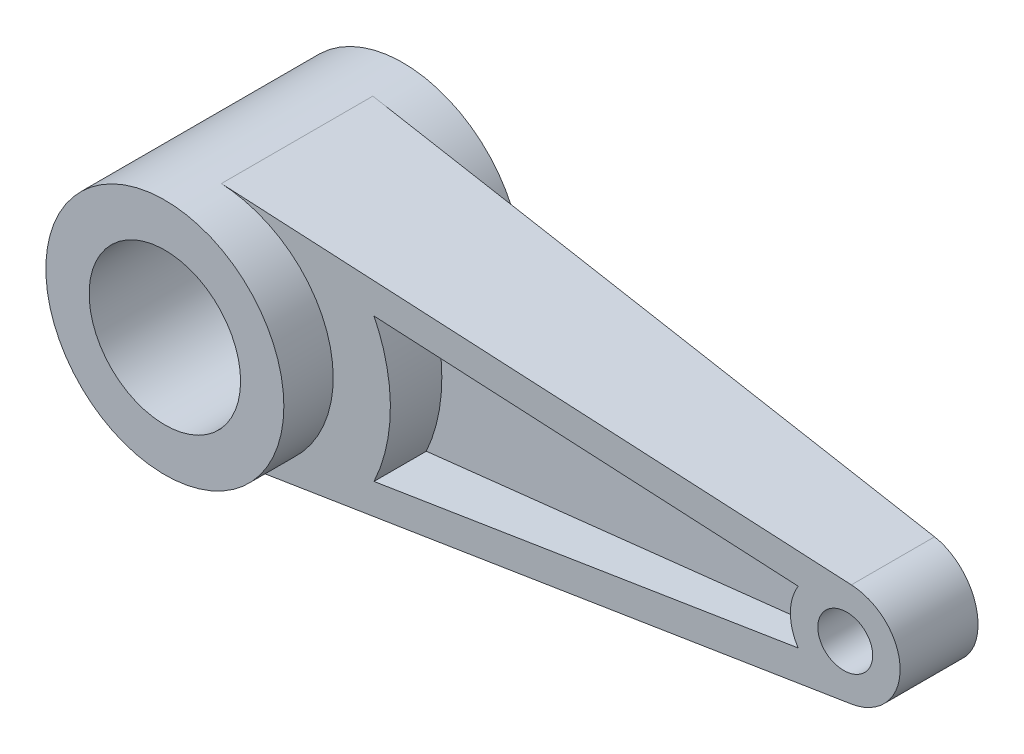
ISO-10303-21;
HEADER;
FILE_DESCRIPTION(('STEP AP214'),'2;1');
FILE_NAME('part.step','',(''),(''),'','','');
FILE_SCHEMA(('AUTOMOTIVE_DESIGN { 1 0 10303 214 1 1 1 1 }'));
ENDSEC;
DATA;
#1=APPLICATION_CONTEXT('core data for automotive mechanical design processes');
#2=APPLICATION_PROTOCOL_DEFINITION('international standard','automotive_design',2000,#1);
#3=PRODUCT_CONTEXT('',#1,'mechanical');
#4=PRODUCT('Part','Part','',(#3));
#5=PRODUCT_RELATED_PRODUCT_CATEGORY('part','',(#4));
#6=PRODUCT_DEFINITION_FORMATION('','',#4);
#7=PRODUCT_DEFINITION_CONTEXT('part definition',#1,'design');
#8=PRODUCT_DEFINITION('design','',#6,#7);
#9=PRODUCT_DEFINITION_SHAPE('','',#8);
#10=(LENGTH_UNIT() NAMED_UNIT(*) SI_UNIT(.MILLI.,.METRE.));
#11=(NAMED_UNIT(*) PLANE_ANGLE_UNIT() SI_UNIT($,.RADIAN.));
#12=(NAMED_UNIT(*) SI_UNIT($,.STERADIAN.) SOLID_ANGLE_UNIT());
#13=UNCERTAINTY_MEASURE_WITH_UNIT(LENGTH_MEASURE(1.E-05),#10,'distance_accuracy_value','');
#14=(GEOMETRIC_REPRESENTATION_CONTEXT(3) GLOBAL_UNCERTAINTY_ASSIGNED_CONTEXT((#13)) GLOBAL_UNIT_ASSIGNED_CONTEXT((#10,
#11,#12)) REPRESENTATION_CONTEXT('',''));
#15=CARTESIAN_POINT('',(0.,0.,0.));
#16=DIRECTION('',(0.,0.,1.));
#17=DIRECTION('',(1.,0.,0.));
#18=AXIS2_PLACEMENT_3D('',#15,#16,#17);
#19=CARTESIAN_POINT('',(1.00946889483169,-34.,17.6173647871382));
#20=DIRECTION('',(0.0572058197716256,0.,0.998362406235459));
#21=DIRECTION('',(0.998362406235459,0.,-0.0572058197716256));
#22=AXIS2_PLACEMENT_3D('',#19,#20,#21);
#23=PLANE('',#22);
#24=CARTESIAN_POINT('',(0.,0.,17.6752070048561));
#25=DIRECTION('',(0.0572058197716256,0.,0.998362406235459));
#26=DIRECTION('',(-0.998362406235459,0.,0.0572058197716256));
#27=AXIS2_PLACEMENT_3D('',#24,#25,#26);
#28=ELLIPSE('',#27,27.5451076966076,27.5);
#29=CARTESIAN_POINT('',(3.05773237156157,-27.3294762617929,17.5));
#30=VERTEX_POINT('',#29);
#31=CARTESIAN_POINT('',(3.05773237156158,27.3294762617929,17.5));
#32=VERTEX_POINT('',#31);
#33=EDGE_CURVE('E360',#30,#32,#28,.T.);
#34=ORIENTED_EDGE('',*,*,#33,.F.);
#35=DIRECTION('',(0.992191769215526,0.111010429269318,-0.056852244409579));
#36=VECTOR('',#35,1.);
#37=CARTESIAN_POINT('',(3.05773237156157,-27.3294762617929,17.5));
#38=LINE('',#37,#36);
#39=CARTESIAN_POINT('',(140.734972421641,-11.9255896415097,9.61114187416411));
#40=VERTEX_POINT('',#39);
#41=EDGE_CURVE('E155',#30,#40,#38,.T.);
#42=ORIENTED_EDGE('',*,*,#41,.T.);
#43=CARTESIAN_POINT('',(139.40068920496,0.,9.68759583991949));
#44=DIRECTION('',(0.0572058197716256,0.,0.998362406235459));
#45=DIRECTION('',(0.998362406235459,0.,-0.0572058197716256));
#46=AXIS2_PLACEMENT_3D('',#43,#44,#45);
#47=ELLIPSE('',#46,12.0196833585197,12.);
#48=CARTESIAN_POINT('',(140.734972421641,11.9255896415097,9.61114187416411));
#49=VERTEX_POINT('',#48);
#50=EDGE_CURVE('E162',#40,#49,#47,.T.);
#51=ORIENTED_EDGE('',*,*,#50,.T.);
#52=DIRECTION('',(0.992191769215526,-0.111010429269318,-0.056852244409579));
#53=VECTOR('',#52,1.);
#54=CARTESIAN_POINT('',(3.05773237156158,27.3294762617929,17.5));
#55=LINE('',#54,#53);
#56=EDGE_CURVE('E152',#32,#49,#55,.T.);
#57=ORIENTED_EDGE('',*,*,#56,.F.);
#58=EDGE_LOOP('',(#34,#42,#51,#57));
#59=FACE_BOUND('',#58,.T.);
#60=CARTESIAN_POINT('',(139.40068920496,0.,9.68759583991948));
#61=DIRECTION('',(0.0572058197716256,0.,0.998362406235459));
#62=DIRECTION('',(-0.998362406235459,0.,0.0572058197716256));
#63=AXIS2_PLACEMENT_3D('',#60,#61,#62);
#64=ELLIPSE('',#63,6.00984167925985,6.00000000000002);
#65=CARTESIAN_POINT('',(133.40068920496,0.,10.0313937598792));
#66=VERTEX_POINT('',#65);
#67=EDGE_CURVE('E177',#66,#66,#64,.T.);
#68=ORIENTED_EDGE('',*,*,#67,.F.);
#69=EDGE_LOOP('',(#68));
#70=FACE_BOUND('',#69,.T.);
#71=DIRECTION('',(0.992191769215526,-0.111010429269318,-0.056852244409579));
#72=VECTOR('',#71,1.);
#73=CARTESIAN_POINT('',(7.01394552238994,19.843162251959,17.2733103579713));
#74=LINE('',#73,#72);
#75=CARTESIAN_POINT('',(36.4139054055988,16.5537757962376,15.5887028488468));
#76=VERTEX_POINT('',#75);
#77=CARTESIAN_POINT('',(129.115571862201,6.181938308143,10.2769294980832));
#78=VERTEX_POINT('',#77);
#79=EDGE_CURVE('E186',#76,#78,#74,.T.);
#80=ORIENTED_EDGE('',*,*,#79,.T.);
#81=CARTESIAN_POINT('',(139.40068920496,0.,9.68759583991949));
#82=DIRECTION('',(0.0572058197716256,0.,0.998362406235459));
#83=DIRECTION('',(0.998362406235459,0.,-0.0572058197716256));
#84=AXIS2_PLACEMENT_3D('',#81,#82,#83);
#85=ELLIPSE('',#84,12.0196833585197,12.);
#86=CARTESIAN_POINT('',(129.115571862201,-6.181938308143,10.2769294980832));
#87=VERTEX_POINT('',#86);
#88=EDGE_CURVE('E190',#78,#87,#85,.T.);
#89=ORIENTED_EDGE('',*,*,#88,.T.);
#90=DIRECTION('',(-0.992191769215526,-0.111010429269318,0.056852244409579));
#91=VECTOR('',#90,1.);
#92=CARTESIAN_POINT('',(-0.475821604440821,-20.6811476996049,17.7024714178358));
#93=LINE('',#92,#91);
#94=CARTESIAN_POINT('',(36.4139054055988,-16.5537757962376,15.5887028488468));
#95=VERTEX_POINT('',#94);
#96=EDGE_CURVE('E172',#87,#95,#93,.T.);
#97=ORIENTED_EDGE('',*,*,#96,.T.);
#98=CARTESIAN_POINT('',(0.,0.,17.6752070048561));
#99=DIRECTION('',(0.0572058197716256,0.,0.998362406235459));
#100=DIRECTION('',(0.998362406235459,0.,-0.0572058197716256));
#101=AXIS2_PLACEMENT_3D('',#98,#99,#100);
#102=ELLIPSE('',#101,40.0656111950656,40.);
#103=EDGE_CURVE('E182',#95,#76,#102,.T.);
#104=ORIENTED_EDGE('',*,*,#103,.T.);
#105=EDGE_LOOP('',(#80,#89,#97,#104));
#106=FACE_BOUND('',#105,.T.);
#107=ADVANCED_FACE('F45',(#59,#70,#106),#23,.T.);
#108=CARTESIAN_POINT('',(3.05773237156157,-27.3294762617929,17.5));
#109=DIRECTION('',(-0.111190268056785,0.993799136792471,0.));
#110=DIRECTION('',(-0.993799136792471,-0.111190268056785,0.));
#111=AXIS2_PLACEMENT_3D('',#108,#109,#110);
#112=PLANE('',#111);
#113=DIRECTION('',(0.,0.,-1.));
#114=VECTOR('',#113,1.);
#115=CARTESIAN_POINT('',(3.05773237156158,-27.3294762617929,17.5));
#116=LINE('',#115,#114);
#117=CARTESIAN_POINT('',(3.05773237156157,-27.3294762617929,-17.5));
#118=VERTEX_POINT('',#117);
#119=EDGE_CURVE('E137',#30,#118,#116,.T.);
#120=ORIENTED_EDGE('',*,*,#119,.T.);
#121=DIRECTION('',(0.992191769215526,0.111010429269318,0.056852244409579));
#122=VECTOR('',#121,1.);
#123=CARTESIAN_POINT('',(5.03202388532305,-27.1085845398038,-17.3868737806958));
#124=LINE('',#123,#122);
#125=CARTESIAN_POINT('',(140.734972421641,-11.9255896415097,-9.61114187416411));
#126=VERTEX_POINT('',#125);
#127=EDGE_CURVE('E145',#118,#126,#124,.T.);
#128=ORIENTED_EDGE('',*,*,#127,.T.);
#129=DIRECTION('',(0.,0.,-1.));
#130=VECTOR('',#129,1.);
#131=CARTESIAN_POINT('',(140.734972421641,-11.9255896415097,17.5));
#132=LINE('',#131,#130);
#133=EDGE_CURVE('E169',#40,#126,#132,.T.);
#134=ORIENTED_EDGE('',*,*,#133,.F.);
#135=ORIENTED_EDGE('',*,*,#41,.F.);
#136=EDGE_LOOP('',(#120,#128,#134,#135));
#137=FACE_BOUND('',#136,.T.);
#138=ADVANCED_FACE('F47',(#137),#112,.F.);
#139=CARTESIAN_POINT('',(139.40068920496,0.,17.5));
#140=DIRECTION('',(0.,0.,-1.));
#141=DIRECTION('',(-1.,0.,0.));
#142=AXIS2_PLACEMENT_3D('',#139,#140,#141);
#143=CYLINDRICAL_SURFACE('',#142,12.);
#144=CARTESIAN_POINT('',(139.40068920496,0.,-9.68759583991949));
#145=DIRECTION('',(-0.0572058197716256,0.,0.998362406235459));
#146=DIRECTION('',(-0.998362406235459,0.,-0.0572058197716256));
#147=AXIS2_PLACEMENT_3D('',#144,#145,#146);
#148=ELLIPSE('',#147,12.0196833585197,12.);
#149=CARTESIAN_POINT('',(140.734972421641,11.9255896415097,-9.6111418741641));
#150=VERTEX_POINT('',#149);
#151=EDGE_CURVE('E147',#126,#150,#148,.T.);
#152=ORIENTED_EDGE('',*,*,#151,.T.);
#153=DIRECTION('',(0.,0.,-1.));
#154=VECTOR('',#153,1.);
#155=CARTESIAN_POINT('',(140.734972421641,11.9255896415097,17.5));
#156=LINE('',#155,#154);
#157=EDGE_CURVE('E160',#49,#150,#156,.T.);
#158=ORIENTED_EDGE('',*,*,#157,.F.);
#159=ORIENTED_EDGE('',*,*,#50,.F.);
#160=ORIENTED_EDGE('',*,*,#133,.T.);
#161=EDGE_LOOP('',(#152,#158,#159,#160));
#162=FACE_BOUND('',#161,.T.);
#163=ADVANCED_FACE('F275',(#162),#143,.T.);
#164=CARTESIAN_POINT('',(3.05773237156158,27.3294762617929,17.5));
#165=DIRECTION('',(0.111190268056785,0.993799136792471,0.));
#166=DIRECTION('',(-0.993799136792471,0.111190268056785,0.));
#167=AXIS2_PLACEMENT_3D('',#164,#165,#166);
#168=PLANE('',#167);
#169=DIRECTION('',(0.992191769215526,-0.111010429269318,0.056852244409579));
#170=VECTOR('',#169,1.);
#171=CARTESIAN_POINT('',(5.03202388532305,27.1085845398038,-17.3868737806958));
#172=LINE('',#171,#170);
#173=CARTESIAN_POINT('',(3.05773237156158,27.3294762617929,-17.5));
#174=VERTEX_POINT('',#173);
#175=EDGE_CURVE('E259',#174,#150,#172,.T.);
#176=ORIENTED_EDGE('',*,*,#175,.F.);
#177=DIRECTION('',(0.,0.,-1.));
#178=VECTOR('',#177,1.);
#179=CARTESIAN_POINT('',(3.05773237156158,27.3294762617929,17.5));
#180=LINE('',#179,#178);
#181=EDGE_CURVE('E140',#32,#174,#180,.T.);
#182=ORIENTED_EDGE('',*,*,#181,.F.);
#183=ORIENTED_EDGE('',*,*,#56,.T.);
#184=ORIENTED_EDGE('',*,*,#157,.T.);
#185=EDGE_LOOP('',(#176,#182,#183,#184));
#186=FACE_BOUND('',#185,.T.);
#187=ADVANCED_FACE('F274',(#186),#168,.T.);
#188=CARTESIAN_POINT('',(1.00946889483169,-34.,-17.6173647871382));
#189=DIRECTION('',(-0.0572058197716256,0.,0.998362406235459));
#190=DIRECTION('',(0.998362406235459,0.,0.0572058197716256));
#191=AXIS2_PLACEMENT_3D('',#188,#189,#190);
#192=PLANE('',#191);
#193=DIRECTION('',(0.992191769215526,0.111010429269318,0.056852244409579));
#194=VECTOR('',#193,1.);
#195=CARTESIAN_POINT('',(-0.475821604440821,-20.6811476996049,-17.7024714178358));
#196=LINE('',#195,#194);
#197=CARTESIAN_POINT('',(36.4139054055988,-16.5537757962376,-15.5887028488468));
#198=VERTEX_POINT('',#197);
#199=CARTESIAN_POINT('',(129.115571862201,-6.181938308143,-10.2769294980832));
#200=VERTEX_POINT('',#199);
#201=EDGE_CURVE('E202',#198,#200,#196,.T.);
#202=ORIENTED_EDGE('',*,*,#201,.T.);
#203=CARTESIAN_POINT('',(139.40068920496,0.,-9.68759583991949));
#204=DIRECTION('',(-0.0572058197716256,0.,0.998362406235459));
#205=DIRECTION('',(0.998362406235459,0.,0.0572058197716256));
#206=AXIS2_PLACEMENT_3D('',#203,#204,#205);
#207=ELLIPSE('',#206,12.0196833585197,12.);
#208=CARTESIAN_POINT('',(129.115571862201,6.181938308143,-10.2769294980832));
#209=VERTEX_POINT('',#208);
#210=EDGE_CURVE('E54',#200,#209,#207,.F.);
#211=ORIENTED_EDGE('',*,*,#210,.T.);
#212=DIRECTION('',(-0.992191769215526,0.111010429269318,-0.056852244409579));
#213=VECTOR('',#212,1.);
#214=CARTESIAN_POINT('',(7.01394552238994,19.843162251959,-17.2733103579713));
#215=LINE('',#214,#213);
#216=CARTESIAN_POINT('',(36.4139054055988,16.5537757962376,-15.5887028488468));
#217=VERTEX_POINT('',#216);
#218=EDGE_CURVE('E194',#209,#217,#215,.T.);
#219=ORIENTED_EDGE('',*,*,#218,.T.);
#220=CARTESIAN_POINT('',(0.,0.,-17.6752070048561));
#221=DIRECTION('',(-0.0572058197716256,0.,0.998362406235459));
#222=DIRECTION('',(0.998362406235459,0.,0.0572058197716256));
#223=AXIS2_PLACEMENT_3D('',#220,#221,#222);
#224=ELLIPSE('',#223,40.0656111950656,40.);
#225=EDGE_CURVE('E198',#217,#198,#224,.F.);
#226=ORIENTED_EDGE('',*,*,#225,.T.);
#227=EDGE_LOOP('',(#202,#211,#219,#226));
#228=FACE_BOUND('',#227,.T.);
#229=CARTESIAN_POINT('',(139.40068920496,0.,-9.68759583991949));
#230=DIRECTION('',(-0.0572058197716256,0.,0.998362406235459));
#231=DIRECTION('',(0.998362406235459,0.,0.0572058197716256));
#232=AXIS2_PLACEMENT_3D('',#229,#230,#231);
#233=ELLIPSE('',#232,6.00984167925985,6.00000000000002);
#234=CARTESIAN_POINT('',(145.40068920496,0.,-9.34379791995975));
#235=VERTEX_POINT('',#234);
#236=EDGE_CURVE('E173',#235,#235,#233,.T.);
#237=ORIENTED_EDGE('',*,*,#236,.T.);
#238=EDGE_LOOP('',(#237));
#239=FACE_BOUND('',#238,.T.);
#240=ORIENTED_EDGE('',*,*,#127,.F.);
#241=CARTESIAN_POINT('',(0.,0.,-17.6752070048561));
#242=DIRECTION('',(-0.0572058197716256,0.,0.998362406235459));
#243=DIRECTION('',(0.998362406235459,0.,0.0572058197716256));
#244=AXIS2_PLACEMENT_3D('',#241,#242,#243);
#245=ELLIPSE('',#244,27.5451076966076,27.5);
#246=EDGE_CURVE('E11',#118,#174,#245,.T.);
#247=ORIENTED_EDGE('',*,*,#246,.T.);
#248=ORIENTED_EDGE('',*,*,#175,.T.);
#249=ORIENTED_EDGE('',*,*,#151,.F.);
#250=EDGE_LOOP('',(#240,#247,#248,#249));
#251=FACE_BOUND('',#250,.T.);
#252=ADVANCED_FACE('F146',(#228,#239,#251),#192,.F.);
#253=CARTESIAN_POINT('',(139.40068920496,0.,-34.));
#254=DIRECTION('',(0.,0.,1.));
#255=DIRECTION('',(1.,0.,0.));
#256=AXIS2_PLACEMENT_3D('',#253,#254,#255);
#257=CYLINDRICAL_SURFACE('',#256,6.00000000000002);
#258=ORIENTED_EDGE('',*,*,#67,.T.);
#259=EDGE_LOOP('',(#258));
#260=FACE_BOUND('',#259,.T.);
#261=ORIENTED_EDGE('',*,*,#236,.F.);
#262=EDGE_LOOP('',(#261));
#263=FACE_BOUND('',#262,.T.);
#264=ADVANCED_FACE('F289',(#260,#263),#257,.F.);
#265=CARTESIAN_POINT('',(139.40068920496,0.,56.5));
#266=DIRECTION('',(0.,0.,-1.));
#267=DIRECTION('',(-1.,0.,0.));
#268=AXIS2_PLACEMENT_3D('',#265,#266,#267);
#269=CYLINDRICAL_SURFACE('',#268,12.);
#270=DIRECTION('',(0.,0.,-1.));
#271=VECTOR('',#270,1.);
#272=CARTESIAN_POINT('',(129.115571862201,6.181938308143,56.5));
#273=LINE('',#272,#271);
#274=CARTESIAN_POINT('',(129.115571862201,6.181938308143,3.5));
#275=VERTEX_POINT('',#274);
#276=EDGE_CURVE('E178',#78,#275,#273,.T.);
#277=ORIENTED_EDGE('',*,*,#276,.T.);
#278=CARTESIAN_POINT('',(139.40068920496,0.,3.5));
#279=DIRECTION('',(0.,0.,-1.));
#280=DIRECTION('',(1.,0.,0.));
#281=AXIS2_PLACEMENT_3D('',#278,#279,#280);
#282=CIRCLE('',#281,12.);
#283=CARTESIAN_POINT('',(129.115571862201,-6.181938308143,3.5));
#284=VERTEX_POINT('',#283);
#285=EDGE_CURVE('E224',#284,#275,#282,.T.);
#286=ORIENTED_EDGE('',*,*,#285,.F.);
#287=DIRECTION('',(0.,0.,-1.));
#288=VECTOR('',#287,1.);
#289=CARTESIAN_POINT('',(129.115571862201,-6.181938308143,56.5));
#290=LINE('',#289,#288);
#291=EDGE_CURVE('E246',#87,#284,#290,.T.);
#292=ORIENTED_EDGE('',*,*,#291,.F.);
#293=ORIENTED_EDGE('',*,*,#88,.F.);
#294=EDGE_LOOP('',(#277,#286,#292,#293));
#295=FACE_BOUND('',#294,.T.);
#296=ADVANCED_FACE('F292',(#295),#269,.T.);
#297=CARTESIAN_POINT('',(36.4139054055988,16.5537757962376,56.5));
#298=DIRECTION('',(-0.111190268056785,-0.993799136792471,0.));
#299=DIRECTION('',(0.993799136792471,-0.111190268056785,0.));
#300=AXIS2_PLACEMENT_3D('',#297,#298,#299);
#301=PLANE('',#300);
#302=DIRECTION('',(0.,0.,-1.));
#303=VECTOR('',#302,1.);
#304=CARTESIAN_POINT('',(36.4139054055988,16.5537757962376,56.5));
#305=LINE('',#304,#303);
#306=CARTESIAN_POINT('',(36.4139054055988,16.5537757962376,3.5));
#307=VERTEX_POINT('',#306);
#308=EDGE_CURVE('E251',#76,#307,#305,.T.);
#309=ORIENTED_EDGE('',*,*,#308,.T.);
#310=DIRECTION('',(-0.993799136792471,0.111190268056785,0.));
#311=VECTOR('',#310,1.);
#312=CARTESIAN_POINT('',(36.4139054055988,16.5537757962376,3.5));
#313=LINE('',#312,#311);
#314=EDGE_CURVE('E230',#275,#307,#313,.T.);
#315=ORIENTED_EDGE('',*,*,#314,.F.);
#316=ORIENTED_EDGE('',*,*,#276,.F.);
#317=ORIENTED_EDGE('',*,*,#79,.F.);
#318=EDGE_LOOP('',(#309,#315,#316,#317));
#319=FACE_BOUND('',#318,.T.);
#320=ADVANCED_FACE('F296',(#319),#301,.T.);
#321=CARTESIAN_POINT('',(0.,0.,56.5));
#322=DIRECTION('',(0.,0.,-1.));
#323=DIRECTION('',(-1.,0.,0.));
#324=AXIS2_PLACEMENT_3D('',#321,#322,#323);
#325=CYLINDRICAL_SURFACE('',#324,40.);
#326=DIRECTION('',(0.,0.,-1.));
#327=VECTOR('',#326,1.);
#328=CARTESIAN_POINT('',(36.4139054055988,-16.5537757962376,56.5));
#329=LINE('',#328,#327);
#330=CARTESIAN_POINT('',(36.4139054055988,-16.5537757962376,3.5));
#331=VERTEX_POINT('',#330);
#332=EDGE_CURVE('E69',#95,#331,#329,.T.);
#333=ORIENTED_EDGE('',*,*,#332,.T.);
#334=CARTESIAN_POINT('',(0.,0.,3.5));
#335=DIRECTION('',(0.,0.,-1.));
#336=DIRECTION('',(1.,0.,0.));
#337=AXIS2_PLACEMENT_3D('',#334,#335,#336);
#338=CIRCLE('',#337,40.);
#339=EDGE_CURVE('E238',#307,#331,#338,.T.);
#340=ORIENTED_EDGE('',*,*,#339,.F.);
#341=ORIENTED_EDGE('',*,*,#308,.F.);
#342=ORIENTED_EDGE('',*,*,#103,.F.);
#343=EDGE_LOOP('',(#333,#340,#341,#342));
#344=FACE_BOUND('',#343,.T.);
#345=ADVANCED_FACE('F300',(#344),#325,.T.);
#346=CARTESIAN_POINT('',(36.4139054055988,-16.5537757962376,56.5));
#347=DIRECTION('',(-0.111190268056785,0.993799136792471,0.));
#348=DIRECTION('',(-0.993799136792471,-0.111190268056785,0.));
#349=AXIS2_PLACEMENT_3D('',#346,#347,#348);
#350=PLANE('',#349);
#351=ORIENTED_EDGE('',*,*,#291,.T.);
#352=DIRECTION('',(0.993799136792471,0.111190268056785,0.));
#353=VECTOR('',#352,1.);
#354=CARTESIAN_POINT('',(36.4139054055988,-16.5537757962376,3.5));
#355=LINE('',#354,#353);
#356=EDGE_CURVE('E242',#331,#284,#355,.T.);
#357=ORIENTED_EDGE('',*,*,#356,.F.);
#358=ORIENTED_EDGE('',*,*,#332,.F.);
#359=ORIENTED_EDGE('',*,*,#96,.F.);
#360=EDGE_LOOP('',(#351,#357,#358,#359));
#361=FACE_BOUND('',#360,.T.);
#362=ADVANCED_FACE('F304',(#361),#350,.T.);
#363=CARTESIAN_POINT('',(139.40068920496,0.,3.5));
#364=DIRECTION('',(0.,0.,1.));
#365=DIRECTION('',(1.,0.,0.));
#366=AXIS2_PLACEMENT_3D('',#363,#364,#365);
#367=PLANE('',#366);
#368=ORIENTED_EDGE('',*,*,#285,.T.);
#369=ORIENTED_EDGE('',*,*,#314,.T.);
#370=ORIENTED_EDGE('',*,*,#339,.T.);
#371=ORIENTED_EDGE('',*,*,#356,.T.);
#372=EDGE_LOOP('',(#368,#369,#370,#371));
#373=FACE_BOUND('',#372,.T.);
#374=ADVANCED_FACE('F308',(#373),#367,.T.);
#375=CARTESIAN_POINT('',(139.40068920496,0.,-56.5));
#376=DIRECTION('',(0.,0.,1.));
#377=DIRECTION('',(1.,0.,0.));
#378=AXIS2_PLACEMENT_3D('',#375,#376,#377);
#379=CYLINDRICAL_SURFACE('',#378,12.);
#380=DIRECTION('',(0.,0.,1.));
#381=VECTOR('',#380,1.);
#382=CARTESIAN_POINT('',(129.115571862201,-6.181938308143,-56.5));
#383=LINE('',#382,#381);
#384=CARTESIAN_POINT('',(129.115571862201,-6.181938308143,-3.5));
#385=VERTEX_POINT('',#384);
#386=EDGE_CURVE('E214',#200,#385,#383,.T.);
#387=ORIENTED_EDGE('',*,*,#386,.T.);
#388=CARTESIAN_POINT('',(139.40068920496,0.,-3.5));
#389=DIRECTION('',(0.,0.,-1.));
#390=DIRECTION('',(1.,0.,0.));
#391=AXIS2_PLACEMENT_3D('',#388,#389,#390);
#392=CIRCLE('',#391,12.);
#393=CARTESIAN_POINT('',(129.115571862201,6.181938308143,-3.5));
#394=VERTEX_POINT('',#393);
#395=EDGE_CURVE('E366',#385,#394,#392,.T.);
#396=ORIENTED_EDGE('',*,*,#395,.T.);
#397=DIRECTION('',(0.,0.,1.));
#398=VECTOR('',#397,1.);
#399=CARTESIAN_POINT('',(129.115571862201,6.181938308143,-56.5));
#400=LINE('',#399,#398);
#401=EDGE_CURVE('E216',#209,#394,#400,.T.);
#402=ORIENTED_EDGE('',*,*,#401,.F.);
#403=ORIENTED_EDGE('',*,*,#210,.F.);
#404=EDGE_LOOP('',(#387,#396,#402,#403));
#405=FACE_BOUND('',#404,.T.);
#406=ADVANCED_FACE('F212',(#405),#379,.T.);
#407=CARTESIAN_POINT('',(36.4139054055988,-16.5537757962376,-56.5));
#408=DIRECTION('',(0.111190268056785,-0.993799136792471,0.));
#409=DIRECTION('',(0.993799136792471,0.111190268056785,0.));
#410=AXIS2_PLACEMENT_3D('',#407,#408,#409);
#411=PLANE('',#410);
#412=DIRECTION('',(0.,0.,1.));
#413=VECTOR('',#412,1.);
#414=CARTESIAN_POINT('',(36.4139054055988,-16.5537757962376,-56.5));
#415=LINE('',#414,#413);
#416=CARTESIAN_POINT('',(36.4139054055988,-16.5537757962376,-3.5));
#417=VERTEX_POINT('',#416);
#418=EDGE_CURVE('E225',#198,#417,#415,.T.);
#419=ORIENTED_EDGE('',*,*,#418,.T.);
#420=DIRECTION('',(0.993799136792471,0.111190268056785,0.));
#421=VECTOR('',#420,1.);
#422=CARTESIAN_POINT('',(36.4139054055988,-16.5537757962376,-3.5));
#423=LINE('',#422,#421);
#424=EDGE_CURVE('E222',#417,#385,#423,.T.);
#425=ORIENTED_EDGE('',*,*,#424,.T.);
#426=ORIENTED_EDGE('',*,*,#386,.F.);
#427=ORIENTED_EDGE('',*,*,#201,.F.);
#428=EDGE_LOOP('',(#419,#425,#426,#427));
#429=FACE_BOUND('',#428,.T.);
#430=ADVANCED_FACE('F219',(#429),#411,.F.);
#431=CARTESIAN_POINT('',(0.,0.,-56.5));
#432=DIRECTION('',(0.,0.,1.));
#433=DIRECTION('',(1.,0.,0.));
#434=AXIS2_PLACEMENT_3D('',#431,#432,#433);
#435=CYLINDRICAL_SURFACE('',#434,40.);
#436=DIRECTION('',(0.,0.,1.));
#437=VECTOR('',#436,1.);
#438=CARTESIAN_POINT('',(36.4139054055988,16.5537757962376,-56.5));
#439=LINE('',#438,#437);
#440=CARTESIAN_POINT('',(36.4139054055988,16.5537757962376,-3.5));
#441=VERTEX_POINT('',#440);
#442=EDGE_CURVE('E61',#217,#441,#439,.T.);
#443=ORIENTED_EDGE('',*,*,#442,.T.);
#444=CARTESIAN_POINT('',(0.,0.,-3.5));
#445=DIRECTION('',(0.,0.,-1.));
#446=DIRECTION('',(1.,0.,0.));
#447=AXIS2_PLACEMENT_3D('',#444,#445,#446);
#448=CIRCLE('',#447,40.);
#449=EDGE_CURVE('E371',#441,#417,#448,.T.);
#450=ORIENTED_EDGE('',*,*,#449,.T.);
#451=ORIENTED_EDGE('',*,*,#418,.F.);
#452=ORIENTED_EDGE('',*,*,#225,.F.);
#453=EDGE_LOOP('',(#443,#450,#451,#452));
#454=FACE_BOUND('',#453,.T.);
#455=ADVANCED_FACE('F316',(#454),#435,.T.);
#456=CARTESIAN_POINT('',(36.4139054055988,16.5537757962376,-56.5));
#457=DIRECTION('',(0.111190268056785,0.993799136792471,0.));
#458=DIRECTION('',(-0.993799136792471,0.111190268056785,0.));
#459=AXIS2_PLACEMENT_3D('',#456,#457,#458);
#460=PLANE('',#459);
#461=ORIENTED_EDGE('',*,*,#401,.T.);
#462=DIRECTION('',(-0.993799136792471,0.111190268056785,0.));
#463=VECTOR('',#462,1.);
#464=CARTESIAN_POINT('',(36.4139054055988,16.5537757962376,-3.5));
#465=LINE('',#464,#463);
#466=EDGE_CURVE('E375',#394,#441,#465,.T.);
#467=ORIENTED_EDGE('',*,*,#466,.T.);
#468=ORIENTED_EDGE('',*,*,#442,.F.);
#469=ORIENTED_EDGE('',*,*,#218,.F.);
#470=EDGE_LOOP('',(#461,#467,#468,#469));
#471=FACE_BOUND('',#470,.T.);
#472=ADVANCED_FACE('F319',(#471),#460,.F.);
#473=CARTESIAN_POINT('',(139.40068920496,0.,-3.5));
#474=DIRECTION('',(0.,0.,-1.));
#475=DIRECTION('',(1.,0.,0.));
#476=AXIS2_PLACEMENT_3D('',#473,#474,#475);
#477=PLANE('',#476);
#478=ORIENTED_EDGE('',*,*,#395,.F.);
#479=ORIENTED_EDGE('',*,*,#424,.F.);
#480=ORIENTED_EDGE('',*,*,#449,.F.);
#481=ORIENTED_EDGE('',*,*,#466,.F.);
#482=EDGE_LOOP('',(#478,#479,#480,#481));
#483=FACE_BOUND('',#482,.T.);
#484=ADVANCED_FACE('F323',(#483),#477,.T.);
#485=CARTESIAN_POINT('',(0.,0.,27.5));
#486=DIRECTION('',(0.,0.,1.));
#487=DIRECTION('',(1.,0.,0.));
#488=AXIS2_PLACEMENT_3D('',#485,#486,#487);
#489=PLANE('',#488);
#490=CARTESIAN_POINT('',(0.,0.,27.5));
#491=DIRECTION('',(0.,0.,1.));
#492=DIRECTION('',(1.,0.,0.));
#493=AXIS2_PLACEMENT_3D('',#490,#491,#492);
#494=CIRCLE('',#493,27.5);
#495=CARTESIAN_POINT('',(27.5,0.,27.5));
#496=VERTEX_POINT('',#495);
#497=EDGE_CURVE('E356',#496,#496,#494,.T.);
#498=ORIENTED_EDGE('',*,*,#497,.T.);
#499=EDGE_LOOP('',(#498));
#500=FACE_BOUND('',#499,.T.);
#501=CARTESIAN_POINT('',(0.,0.,27.5));
#502=DIRECTION('',(0.,0.,1.));
#503=DIRECTION('',(1.,0.,0.));
#504=AXIS2_PLACEMENT_3D('',#501,#502,#503);
#505=CIRCLE('',#504,17.5);
#506=CARTESIAN_POINT('',(17.5,0.,27.5));
#507=VERTEX_POINT('',#506);
#508=EDGE_CURVE('E345',#507,#507,#505,.T.);
#509=ORIENTED_EDGE('',*,*,#508,.F.);
#510=EDGE_LOOP('',(#509));
#511=FACE_BOUND('',#510,.T.);
#512=ADVANCED_FACE('F326',(#500,#511),#489,.T.);
#513=CARTESIAN_POINT('',(0.,0.,-27.5));
#514=DIRECTION('',(0.,0.,1.));
#515=DIRECTION('',(1.,0.,0.));
#516=AXIS2_PLACEMENT_3D('',#513,#514,#515);
#517=PLANE('',#516);
#518=CARTESIAN_POINT('',(0.,0.,-27.5));
#519=DIRECTION('',(0.,0.,1.));
#520=DIRECTION('',(1.,0.,0.));
#521=AXIS2_PLACEMENT_3D('',#518,#519,#520);
#522=CIRCLE('',#521,27.5);
#523=CARTESIAN_POINT('',(27.5,0.,-27.5));
#524=VERTEX_POINT('',#523);
#525=EDGE_CURVE('E353',#524,#524,#522,.T.);
#526=ORIENTED_EDGE('',*,*,#525,.F.);
#527=EDGE_LOOP('',(#526));
#528=FACE_BOUND('',#527,.T.);
#529=CARTESIAN_POINT('',(0.,0.,-27.5));
#530=DIRECTION('',(0.,0.,1.));
#531=DIRECTION('',(1.,0.,0.));
#532=AXIS2_PLACEMENT_3D('',#529,#530,#531);
#533=CIRCLE('',#532,17.5);
#534=CARTESIAN_POINT('',(17.5,0.,-27.5));
#535=VERTEX_POINT('',#534);
#536=EDGE_CURVE('E348',#535,#535,#533,.T.);
#537=ORIENTED_EDGE('',*,*,#536,.T.);
#538=EDGE_LOOP('',(#537));
#539=FACE_BOUND('',#538,.T.);
#540=ADVANCED_FACE('F331',(#528,#539),#517,.F.);
#541=CARTESIAN_POINT('',(0.,0.,27.5));
#542=DIRECTION('',(0.,0.,-1.));
#543=DIRECTION('',(-1.,0.,0.));
#544=AXIS2_PLACEMENT_3D('',#541,#542,#543);
#545=CYLINDRICAL_SURFACE('',#544,27.5);
#546=ORIENTED_EDGE('',*,*,#33,.T.);
#547=ORIENTED_EDGE('',*,*,#181,.T.);
#548=ORIENTED_EDGE('',*,*,#246,.F.);
#549=ORIENTED_EDGE('',*,*,#119,.F.);
#550=EDGE_LOOP('',(#546,#547,#548,#549));
#551=FACE_BOUND('',#550,.T.);
#552=ORIENTED_EDGE('',*,*,#497,.F.);
#553=EDGE_LOOP('',(#552));
#554=FACE_BOUND('',#553,.T.);
#555=ORIENTED_EDGE('',*,*,#525,.T.);
#556=EDGE_LOOP('',(#555));
#557=FACE_BOUND('',#556,.T.);
#558=ADVANCED_FACE('F134',(#551,#554,#557),#545,.T.);
#559=CARTESIAN_POINT('',(0.,0.,27.5));
#560=DIRECTION('',(0.,0.,-1.));
#561=DIRECTION('',(-1.,0.,0.));
#562=AXIS2_PLACEMENT_3D('',#559,#560,#561);
#563=CYLINDRICAL_SURFACE('',#562,17.5);
#564=ORIENTED_EDGE('',*,*,#508,.T.);
#565=EDGE_LOOP('',(#564));
#566=FACE_BOUND('',#565,.T.);
#567=ORIENTED_EDGE('',*,*,#536,.F.);
#568=EDGE_LOOP('',(#567));
#569=FACE_BOUND('',#568,.T.);
#570=ADVANCED_FACE('F330',(#566,#569),#563,.F.);
#571=CLOSED_SHELL('',(#107,#138,#163,#187,#252,#264,#296,#320,#345,#362,#374,#406,#430,#455,
#472,#484,#512,#540,#558,#570));
#572=MANIFOLD_SOLID_BREP('B2',#571);
#573=ADVANCED_BREP_SHAPE_REPRESENTATION('',(#18,#572),#14);
#574=SHAPE_DEFINITION_REPRESENTATION(#9,#573);
ENDSEC;
END-ISO-10303-21;
